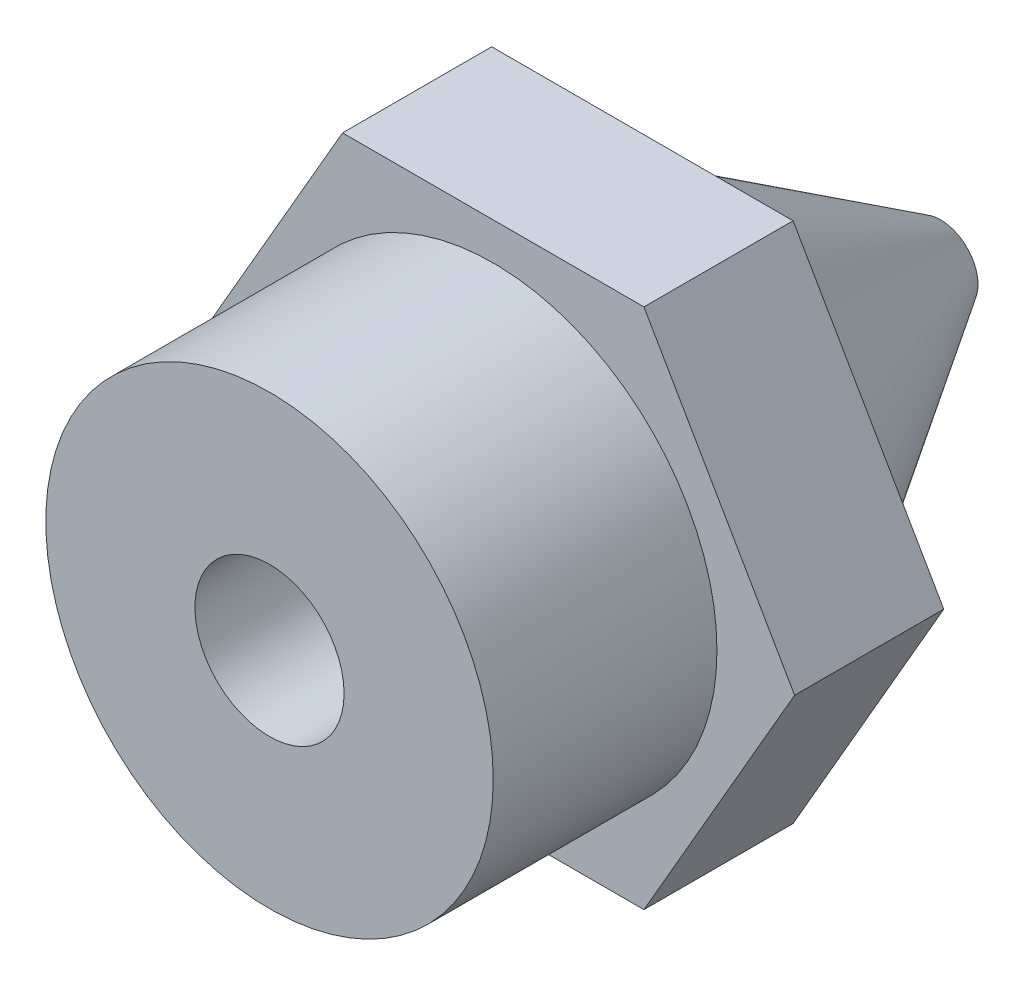
ISO-10303-21;
HEADER;
FILE_DESCRIPTION(('STEP AP214'),'2;1');
FILE_NAME('part.step','',(''),(''),'','','');
FILE_SCHEMA(('AUTOMOTIVE_DESIGN { 1 0 10303 214 1 1 1 1 }'));
ENDSEC;
DATA;
#1=APPLICATION_CONTEXT('core data for automotive mechanical design processes');
#2=APPLICATION_PROTOCOL_DEFINITION('international standard','automotive_design',2000,#1);
#3=PRODUCT_CONTEXT('',#1,'mechanical');
#4=PRODUCT('Part','Part','',(#3));
#5=PRODUCT_RELATED_PRODUCT_CATEGORY('part','',(#4));
#6=PRODUCT_DEFINITION_FORMATION('','',#4);
#7=PRODUCT_DEFINITION_CONTEXT('part definition',#1,'design');
#8=PRODUCT_DEFINITION('design','',#6,#7);
#9=PRODUCT_DEFINITION_SHAPE('','',#8);
#10=(LENGTH_UNIT() NAMED_UNIT(*) SI_UNIT(.MILLI.,.METRE.));
#11=(NAMED_UNIT(*) PLANE_ANGLE_UNIT() SI_UNIT($,.RADIAN.));
#12=(NAMED_UNIT(*) SI_UNIT($,.STERADIAN.) SOLID_ANGLE_UNIT());
#13=UNCERTAINTY_MEASURE_WITH_UNIT(LENGTH_MEASURE(1.E-05),#10,'distance_accuracy_value','');
#14=(GEOMETRIC_REPRESENTATION_CONTEXT(3) GLOBAL_UNCERTAINTY_ASSIGNED_CONTEXT((#13)) GLOBAL_UNIT_ASSIGNED_CONTEXT((#10,
#11,#12)) REPRESENTATION_CONTEXT('',''));
#15=CARTESIAN_POINT('',(0.,0.,0.));
#16=DIRECTION('',(0.,0.,1.));
#17=DIRECTION('',(1.,0.,0.));
#18=AXIS2_PLACEMENT_3D('',#15,#16,#17);
#19=CARTESIAN_POINT('',(2.02072594216373,-3.49999999999998,9.));
#20=DIRECTION('',(-0.866025403784442,0.499999999999995,0.));
#21=DIRECTION('',(-0.499999999999995,-0.866025403784442,0.));
#22=AXIS2_PLACEMENT_3D('',#19,#20,#21);
#23=PLANE('',#22);
#24=DIRECTION('',(-0.499999999999995,-0.866025403784442,0.));
#25=VECTOR('',#24,1.);
#26=CARTESIAN_POINT('',(2.02072594216373,-3.49999999999998,4.));
#27=LINE('',#26,#25);
#28=CARTESIAN_POINT('',(4.04145188432738,0.,4.));
#29=VERTEX_POINT('',#28);
#30=CARTESIAN_POINT('',(2.02072594216373,-3.49999999999998,4.));
#31=VERTEX_POINT('',#30);
#32=EDGE_CURVE('E50',#29,#31,#27,.T.);
#33=ORIENTED_EDGE('',*,*,#32,.F.);
#34=DIRECTION('',(0.,0.,-1.));
#35=VECTOR('',#34,1.);
#36=CARTESIAN_POINT('',(4.04145188432738,0.,9.));
#37=LINE('',#36,#35);
#38=CARTESIAN_POINT('',(4.04145188432738,0.,6.));
#39=VERTEX_POINT('',#38);
#40=EDGE_CURVE('E118',#39,#29,#37,.T.);
#41=ORIENTED_EDGE('',*,*,#40,.F.);
#42=DIRECTION('',(0.499999999999995,0.866025403784442,0.));
#43=VECTOR('',#42,1.);
#44=CARTESIAN_POINT('',(2.02072594216373,-3.49999999999998,6.));
#45=LINE('',#44,#43);
#46=CARTESIAN_POINT('',(2.02072594216373,-3.49999999999998,6.));
#47=VERTEX_POINT('',#46);
#48=EDGE_CURVE('E109',#47,#39,#45,.T.);
#49=ORIENTED_EDGE('',*,*,#48,.F.);
#50=DIRECTION('',(0.,0.,-1.));
#51=VECTOR('',#50,1.);
#52=CARTESIAN_POINT('',(2.02072594216373,-3.49999999999998,9.));
#53=LINE('',#52,#51);
#54=EDGE_CURVE('E105',#47,#31,#53,.T.);
#55=ORIENTED_EDGE('',*,*,#54,.T.);
#56=EDGE_LOOP('',(#33,#41,#49,#55));
#57=FACE_BOUND('',#56,.T.);
#58=ADVANCED_FACE('F35',(#57),#23,.F.);
#59=CARTESIAN_POINT('',(4.04145188432738,0.,9.));
#60=DIRECTION('',(-0.866025403784438,-0.500000000000001,0.));
#61=DIRECTION('',(0.500000000000001,-0.866025403784438,0.));
#62=AXIS2_PLACEMENT_3D('',#59,#60,#61);
#63=PLANE('',#62);
#64=DIRECTION('',(0.500000000000001,-0.866025403784438,0.));
#65=VECTOR('',#64,1.);
#66=CARTESIAN_POINT('',(4.04145188432738,0.,4.));
#67=LINE('',#66,#65);
#68=CARTESIAN_POINT('',(2.02072594216368,3.50000000000001,4.));
#69=VERTEX_POINT('',#68);
#70=EDGE_CURVE('E165',#69,#29,#67,.T.);
#71=ORIENTED_EDGE('',*,*,#70,.F.);
#72=DIRECTION('',(0.,0.,-1.));
#73=VECTOR('',#72,1.);
#74=CARTESIAN_POINT('',(2.02072594216368,3.50000000000001,9.));
#75=LINE('',#74,#73);
#76=CARTESIAN_POINT('',(2.02072594216368,3.50000000000001,6.));
#77=VERTEX_POINT('',#76);
#78=EDGE_CURVE('E115',#77,#69,#75,.T.);
#79=ORIENTED_EDGE('',*,*,#78,.F.);
#80=DIRECTION('',(-0.500000000000001,0.866025403784438,0.));
#81=VECTOR('',#80,1.);
#82=CARTESIAN_POINT('',(4.04145188432738,0.,6.));
#83=LINE('',#82,#81);
#84=EDGE_CURVE('E154',#39,#77,#83,.T.);
#85=ORIENTED_EDGE('',*,*,#84,.F.);
#86=ORIENTED_EDGE('',*,*,#40,.T.);
#87=EDGE_LOOP('',(#71,#79,#85,#86));
#88=FACE_BOUND('',#87,.T.);
#89=ADVANCED_FACE('F164',(#88),#63,.F.);
#90=CARTESIAN_POINT('',(2.02072594216368,3.50000000000001,9.));
#91=DIRECTION('',(0.,-1.,0.));
#92=DIRECTION('',(1.,0.,0.));
#93=AXIS2_PLACEMENT_3D('',#90,#91,#92);
#94=PLANE('',#93);
#95=DIRECTION('',(1.,0.,0.));
#96=VECTOR('',#95,1.);
#97=CARTESIAN_POINT('',(2.02072594216368,3.50000000000001,4.));
#98=LINE('',#97,#96);
#99=CARTESIAN_POINT('',(-2.02072594216371,3.49999999999999,4.));
#100=VERTEX_POINT('',#99);
#101=EDGE_CURVE('E168',#100,#69,#98,.T.);
#102=ORIENTED_EDGE('',*,*,#101,.F.);
#103=DIRECTION('',(0.,0.,-1.));
#104=VECTOR('',#103,1.);
#105=CARTESIAN_POINT('',(-2.02072594216371,3.49999999999999,9.));
#106=LINE('',#105,#104);
#107=CARTESIAN_POINT('',(-2.02072594216371,3.49999999999999,6.));
#108=VERTEX_POINT('',#107);
#109=EDGE_CURVE('E107',#108,#100,#106,.T.);
#110=ORIENTED_EDGE('',*,*,#109,.F.);
#111=DIRECTION('',(-1.,0.,0.));
#112=VECTOR('',#111,1.);
#113=CARTESIAN_POINT('',(2.02072594216368,3.50000000000001,6.));
#114=LINE('',#113,#112);
#115=EDGE_CURVE('E152',#77,#108,#114,.T.);
#116=ORIENTED_EDGE('',*,*,#115,.F.);
#117=ORIENTED_EDGE('',*,*,#78,.T.);
#118=EDGE_LOOP('',(#102,#110,#116,#117));
#119=FACE_BOUND('',#118,.T.);
#120=ADVANCED_FACE('F192',(#119),#94,.F.);
#121=CARTESIAN_POINT('',(-2.02072594216371,3.49999999999999,9.));
#122=DIRECTION('',(0.866025403784441,-0.499999999999995,0.));
#123=DIRECTION('',(0.499999999999995,0.866025403784442,0.));
#124=AXIS2_PLACEMENT_3D('',#121,#122,#123);
#125=PLANE('',#124);
#126=DIRECTION('',(0.499999999999995,0.866025403784442,0.));
#127=VECTOR('',#126,1.);
#128=CARTESIAN_POINT('',(-2.02072594216371,3.49999999999999,4.));
#129=LINE('',#128,#127);
#130=CARTESIAN_POINT('',(-4.04145188432738,0.,4.));
#131=VERTEX_POINT('',#130);
#132=EDGE_CURVE('E101',#131,#100,#129,.T.);
#133=ORIENTED_EDGE('',*,*,#132,.F.);
#134=DIRECTION('',(0.,0.,-1.));
#135=VECTOR('',#134,1.);
#136=CARTESIAN_POINT('',(-4.04145188432738,0.,9.));
#137=LINE('',#136,#135);
#138=CARTESIAN_POINT('',(-4.04145188432738,0.,6.));
#139=VERTEX_POINT('',#138);
#140=EDGE_CURVE('E100',#139,#131,#137,.T.);
#141=ORIENTED_EDGE('',*,*,#140,.F.);
#142=DIRECTION('',(-0.499999999999995,-0.866025403784442,0.));
#143=VECTOR('',#142,1.);
#144=CARTESIAN_POINT('',(-2.02072594216371,3.49999999999999,6.));
#145=LINE('',#144,#143);
#146=EDGE_CURVE('E150',#108,#139,#145,.T.);
#147=ORIENTED_EDGE('',*,*,#146,.F.);
#148=ORIENTED_EDGE('',*,*,#109,.T.);
#149=EDGE_LOOP('',(#133,#141,#147,#148));
#150=FACE_BOUND('',#149,.T.);
#151=ADVANCED_FACE('F197',(#150),#125,.F.);
#152=CARTESIAN_POINT('',(-4.04145188432738,0.,9.));
#153=DIRECTION('',(0.866025403784434,0.500000000000007,0.));
#154=DIRECTION('',(-0.500000000000007,0.866025403784435,0.));
#155=AXIS2_PLACEMENT_3D('',#152,#153,#154);
#156=PLANE('',#155);
#157=DIRECTION('',(-0.500000000000007,0.866025403784435,0.));
#158=VECTOR('',#157,1.);
#159=CARTESIAN_POINT('',(-4.04145188432738,0.,4.));
#160=LINE('',#159,#158);
#161=CARTESIAN_POINT('',(-2.02072594216366,-3.50000000000002,4.));
#162=VERTEX_POINT('',#161);
#163=EDGE_CURVE('E87',#162,#131,#160,.T.);
#164=ORIENTED_EDGE('',*,*,#163,.F.);
#165=DIRECTION('',(0.,0.,-1.));
#166=VECTOR('',#165,1.);
#167=CARTESIAN_POINT('',(-2.02072594216366,-3.50000000000002,9.));
#168=LINE('',#167,#166);
#169=CARTESIAN_POINT('',(-2.02072594216366,-3.50000000000002,6.));
#170=VERTEX_POINT('',#169);
#171=EDGE_CURVE('E98',#170,#162,#168,.T.);
#172=ORIENTED_EDGE('',*,*,#171,.F.);
#173=DIRECTION('',(0.500000000000007,-0.866025403784435,0.));
#174=VECTOR('',#173,1.);
#175=CARTESIAN_POINT('',(-4.04145188432738,0.,6.));
#176=LINE('',#175,#174);
#177=EDGE_CURVE('E58',#139,#170,#176,.T.);
#178=ORIENTED_EDGE('',*,*,#177,.F.);
#179=ORIENTED_EDGE('',*,*,#140,.T.);
#180=EDGE_LOOP('',(#164,#172,#178,#179));
#181=FACE_BOUND('',#180,.T.);
#182=ADVANCED_FACE('F97',(#181),#156,.F.);
#183=CARTESIAN_POINT('',(-2.02072594216366,-3.50000000000002,9.));
#184=DIRECTION('',(0.,1.,0.));
#185=DIRECTION('',(-1.,0.,0.));
#186=AXIS2_PLACEMENT_3D('',#183,#184,#185);
#187=PLANE('',#186);
#188=DIRECTION('',(-1.,0.,0.));
#189=VECTOR('',#188,1.);
#190=CARTESIAN_POINT('',(-2.02072594216366,-3.50000000000002,4.));
#191=LINE('',#190,#189);
#192=EDGE_CURVE('E43',#31,#162,#191,.T.);
#193=ORIENTED_EDGE('',*,*,#192,.F.);
#194=ORIENTED_EDGE('',*,*,#54,.F.);
#195=DIRECTION('',(1.,0.,0.));
#196=VECTOR('',#195,1.);
#197=CARTESIAN_POINT('',(-2.02072594216366,-3.50000000000002,6.));
#198=LINE('',#197,#196);
#199=EDGE_CURVE('E93',#170,#47,#198,.T.);
#200=ORIENTED_EDGE('',*,*,#199,.F.);
#201=ORIENTED_EDGE('',*,*,#171,.T.);
#202=EDGE_LOOP('',(#193,#194,#200,#201));
#203=FACE_BOUND('',#202,.T.);
#204=ADVANCED_FACE('F104',(#203),#187,.F.);
#205=CARTESIAN_POINT('',(0.,0.,0.));
#206=DIRECTION('',(0.,0.,1.));
#207=DIRECTION('',(1.,0.,0.));
#208=AXIS2_PLACEMENT_3D('',#205,#206,#207);
#209=PLANE('',#208);
#210=CARTESIAN_POINT('',(0.,0.,0.));
#211=DIRECTION('',(0.,0.,1.));
#212=DIRECTION('',(1.,0.,0.));
#213=AXIS2_PLACEMENT_3D('',#210,#211,#212);
#214=CIRCLE('',#213,0.50052259236269);
#215=CARTESIAN_POINT('',(0.50052259236269,0.,0.));
#216=VERTEX_POINT('',#215);
#217=EDGE_CURVE('E11',#216,#216,#214,.F.);
#218=ORIENTED_EDGE('',*,*,#217,.T.);
#219=EDGE_LOOP('',(#218));
#220=FACE_BOUND('',#219,.T.);
#221=CARTESIAN_POINT('',(0.,0.,0.));
#222=DIRECTION('',(0.,0.,-1.));
#223=DIRECTION('',(-1.,0.,0.));
#224=AXIS2_PLACEMENT_3D('',#221,#222,#223);
#225=CIRCLE('',#224,0.199999999999999);
#226=CARTESIAN_POINT('',(-0.199999999999999,0.,0.));
#227=VERTEX_POINT('',#226);
#228=EDGE_CURVE('E137',#227,#227,#225,.T.);
#229=ORIENTED_EDGE('',*,*,#228,.F.);
#230=EDGE_LOOP('',(#229));
#231=FACE_BOUND('',#230,.T.);
#232=ADVANCED_FACE('F206',(#220,#231),#209,.F.);
#233=CARTESIAN_POINT('',(0.,0.,6.));
#234=DIRECTION('',(0.,0.,1.));
#235=DIRECTION('',(1.,0.,0.));
#236=AXIS2_PLACEMENT_3D('',#233,#234,#235);
#237=PLANE('',#236);
#238=CARTESIAN_POINT('',(0.,0.,6.));
#239=DIRECTION('',(0.,0.,1.));
#240=DIRECTION('',(1.,0.,0.));
#241=AXIS2_PLACEMENT_3D('',#238,#239,#240);
#242=CIRCLE('',#241,3.);
#243=CARTESIAN_POINT('',(3.,0.,6.));
#244=VERTEX_POINT('',#243);
#245=EDGE_CURVE('E144',#244,#244,#242,.T.);
#246=ORIENTED_EDGE('',*,*,#245,.F.);
#247=EDGE_LOOP('',(#246));
#248=FACE_BOUND('',#247,.T.);
#249=ORIENTED_EDGE('',*,*,#48,.T.);
#250=ORIENTED_EDGE('',*,*,#84,.T.);
#251=ORIENTED_EDGE('',*,*,#115,.T.);
#252=ORIENTED_EDGE('',*,*,#146,.T.);
#253=ORIENTED_EDGE('',*,*,#177,.T.);
#254=ORIENTED_EDGE('',*,*,#199,.T.);
#255=EDGE_LOOP('',(#249,#250,#251,#252,#253,#254));
#256=FACE_BOUND('',#255,.T.);
#257=ADVANCED_FACE('F157',(#248,#256),#237,.T.);
#258=CARTESIAN_POINT('',(0.,0.,6.));
#259=DIRECTION('',(0.,0.,1.));
#260=DIRECTION('',(1.,0.,0.));
#261=AXIS2_PLACEMENT_3D('',#258,#259,#260);
#262=CYLINDRICAL_SURFACE('',#261,3.);
#263=ORIENTED_EDGE('',*,*,#245,.T.);
#264=EDGE_LOOP('',(#263));
#265=FACE_BOUND('',#264,.T.);
#266=CARTESIAN_POINT('',(0.,0.,9.));
#267=DIRECTION('',(0.,0.,1.));
#268=DIRECTION('',(1.,0.,0.));
#269=AXIS2_PLACEMENT_3D('',#266,#267,#268);
#270=CIRCLE('',#269,3.);
#271=CARTESIAN_POINT('',(3.,0.,9.));
#272=VERTEX_POINT('',#271);
#273=EDGE_CURVE('E143',#272,#272,#270,.T.);
#274=ORIENTED_EDGE('',*,*,#273,.F.);
#275=EDGE_LOOP('',(#274));
#276=FACE_BOUND('',#275,.T.);
#277=ADVANCED_FACE('F214',(#265,#276),#262,.T.);
#278=CARTESIAN_POINT('',(0.,0.,9.));
#279=DIRECTION('',(0.,0.,1.));
#280=DIRECTION('',(1.,0.,0.));
#281=AXIS2_PLACEMENT_3D('',#278,#279,#280);
#282=PLANE('',#281);
#283=CARTESIAN_POINT('',(0.,0.,9.));
#284=DIRECTION('',(0.,0.,1.));
#285=DIRECTION('',(1.,0.,0.));
#286=AXIS2_PLACEMENT_3D('',#283,#284,#285);
#287=CIRCLE('',#286,0.999999999999999);
#288=CARTESIAN_POINT('',(0.999999999999999,0.,9.));
#289=VERTEX_POINT('',#288);
#290=EDGE_CURVE('E124',#289,#289,#287,.T.);
#291=ORIENTED_EDGE('',*,*,#290,.F.);
#292=EDGE_LOOP('',(#291));
#293=FACE_BOUND('',#292,.T.);
#294=ORIENTED_EDGE('',*,*,#273,.T.);
#295=EDGE_LOOP('',(#294));
#296=FACE_BOUND('',#295,.T.);
#297=ADVANCED_FACE('F210',(#293,#296),#282,.T.);
#298=CARTESIAN_POINT('',(0.,0.,1.5));
#299=DIRECTION('',(0.,0.,1.));
#300=DIRECTION('',(1.,0.,0.));
#301=AXIS2_PLACEMENT_3D('',#298,#299,#300);
#302=CONICAL_SURFACE('',#301,0.999999999999998,1.02974425867665);
#303=CARTESIAN_POINT('',(0.,0.,1.34978484524311));
#304=DIRECTION('',(0.,0.,1.));
#305=DIRECTION('',(1.,0.,0.));
#306=AXIS2_PLACEMENT_3D('',#303,#304,#305);
#307=CIRCLE('',#306,0.749999999999998);
#308=CARTESIAN_POINT('',(0.749999999999998,0.,1.34978484524311));
#309=VERTEX_POINT('',#308);
#310=EDGE_CURVE('E122',#309,#309,#307,.F.);
#311=ORIENTED_EDGE('',*,*,#310,.T.);
#312=EDGE_LOOP('',(#311));
#313=FACE_BOUND('',#312,.T.);
#314=CARTESIAN_POINT('',(0.,0.,1.5));
#315=DIRECTION('',(0.,0.,1.));
#316=DIRECTION('',(1.,0.,0.));
#317=AXIS2_PLACEMENT_3D('',#314,#315,#316);
#318=CIRCLE('',#317,0.999999999999998);
#319=CARTESIAN_POINT('',(0.999999999999998,0.,1.5));
#320=VERTEX_POINT('',#319);
#321=EDGE_CURVE('E129',#320,#320,#318,.T.);
#322=ORIENTED_EDGE('',*,*,#321,.T.);
#323=EDGE_LOOP('',(#322));
#324=FACE_BOUND('',#323,.T.);
#325=ADVANCED_FACE('F213',(#313,#324),#302,.F.);
#326=CARTESIAN_POINT('',(0.,0.,9.));
#327=DIRECTION('',(0.,0.,1.));
#328=DIRECTION('',(1.,0.,0.));
#329=AXIS2_PLACEMENT_3D('',#326,#327,#328);
#330=CYLINDRICAL_SURFACE('',#329,0.999999999999999);
#331=ORIENTED_EDGE('',*,*,#321,.F.);
#332=EDGE_LOOP('',(#331));
#333=FACE_BOUND('',#332,.T.);
#334=ORIENTED_EDGE('',*,*,#290,.T.);
#335=EDGE_LOOP('',(#334));
#336=FACE_BOUND('',#335,.T.);
#337=ADVANCED_FACE('F224',(#333,#336),#330,.F.);
#338=CARTESIAN_POINT('',(0.,0.,9.));
#339=DIRECTION('',(0.,0.,1.));
#340=DIRECTION('',(1.,0.,0.));
#341=AXIS2_PLACEMENT_3D('',#338,#339,#340);
#342=CYLINDRICAL_SURFACE('',#341,0.749999999999998);
#343=CARTESIAN_POINT('',(0.,0.,0.8));
#344=DIRECTION('',(0.,0.,1.));
#345=DIRECTION('',(1.,0.,0.));
#346=AXIS2_PLACEMENT_3D('',#343,#344,#345);
#347=CIRCLE('',#346,0.749999999999998);
#348=CARTESIAN_POINT('',(0.749999999999998,0.,0.8));
#349=VERTEX_POINT('',#348);
#350=EDGE_CURVE('E125',#349,#349,#347,.T.);
#351=ORIENTED_EDGE('',*,*,#350,.F.);
#352=EDGE_LOOP('',(#351));
#353=FACE_BOUND('',#352,.T.);
#354=ORIENTED_EDGE('',*,*,#310,.F.);
#355=EDGE_LOOP('',(#354));
#356=FACE_BOUND('',#355,.T.);
#357=ADVANCED_FACE('F227',(#353,#356),#342,.F.);
#358=CARTESIAN_POINT('',(0.,0.,0.8));
#359=DIRECTION('',(0.,0.,1.));
#360=DIRECTION('',(1.,0.,0.));
#361=AXIS2_PLACEMENT_3D('',#358,#359,#360);
#362=CONICAL_SURFACE('',#361,0.749999999999998,1.02974425867665);
#363=CARTESIAN_POINT('',(0.,0.,0.469526659534841));
#364=DIRECTION('',(0.,0.,1.));
#365=DIRECTION('',(1.,0.,0.));
#366=AXIS2_PLACEMENT_3D('',#363,#364,#365);
#367=CIRCLE('',#366,0.199999999999999);
#368=CARTESIAN_POINT('',(0.199999999999999,0.,0.469526659534841));
#369=VERTEX_POINT('',#368);
#370=EDGE_CURVE('E132',#369,#369,#367,.F.);
#371=CARTESIAN_POINT('',(0.199999999999999,0.,0.469526659534841));
#372=CARTESIAN_POINT('',(0.205729166666666,0.,0.472969090164687));
#373=CARTESIAN_POINT('',(0.211458333333333,0.,0.476411520794532));
#374=CARTESIAN_POINT('',(0.222916666666666,0.,0.483296382054223));
#375=CARTESIAN_POINT('',(0.228645833333333,0.,0.486738812684068));
#376=CARTESIAN_POINT('',(0.240104166666666,0.,0.493623673943759));
#377=CARTESIAN_POINT('',(0.245833333333333,0.,0.497066104573605));
#378=CARTESIAN_POINT('',(0.257291666666666,0.,0.503950965833295));
#379=CARTESIAN_POINT('',(0.263020833333333,0.,0.507393396463141));
#380=CARTESIAN_POINT('',(0.274479166666666,0.,0.514278257722832));
#381=CARTESIAN_POINT('',(0.280208333333333,0.,0.517720688352677));
#382=CARTESIAN_POINT('',(0.291666666666666,0.,0.524605549612368));
#383=CARTESIAN_POINT('',(0.297395833333333,0.,0.528047980242213));
#384=CARTESIAN_POINT('',(0.308854166666666,0.,0.534932841501904));
#385=CARTESIAN_POINT('',(0.314583333333332,0.,0.538375272131749));
#386=CARTESIAN_POINT('',(0.326041666666666,0.,0.54526013339144));
#387=CARTESIAN_POINT('',(0.331770833333332,0.,0.548702564021286));
#388=CARTESIAN_POINT('',(0.343229166666666,0.,0.555587425280976));
#389=CARTESIAN_POINT('',(0.348958333333332,0.,0.559029855910822));
#390=CARTESIAN_POINT('',(0.360416666666666,0.,0.565914717170513));
#391=CARTESIAN_POINT('',(0.366145833333332,0.,0.569357147800358));
#392=CARTESIAN_POINT('',(0.377604166666666,0.,0.576242009060049));
#393=CARTESIAN_POINT('',(0.383333333333332,0.,0.579684439689894));
#394=CARTESIAN_POINT('',(0.394791666666666,0.,0.586569300949585));
#395=CARTESIAN_POINT('',(0.400520833333332,0.,0.590011731579431));
#396=CARTESIAN_POINT('',(0.411979166666665,0.,0.596896592839121));
#397=CARTESIAN_POINT('',(0.417708333333332,0.,0.600339023468967));
#398=CARTESIAN_POINT('',(0.429166666666665,0.,0.607223884728658));
#399=CARTESIAN_POINT('',(0.434895833333332,0.,0.610666315358503));
#400=CARTESIAN_POINT('',(0.446354166666665,0.,0.617551176618194));
#401=CARTESIAN_POINT('',(0.452083333333332,0.,0.620993607248039));
#402=CARTESIAN_POINT('',(0.463541666666665,0.,0.62787846850773));
#403=CARTESIAN_POINT('',(0.469270833333332,0.,0.631320899137575));
#404=CARTESIAN_POINT('',(0.480729166666665,0.,0.638205760397266));
#405=CARTESIAN_POINT('',(0.486458333333332,0.,0.641648191027112));
#406=CARTESIAN_POINT('',(0.497916666666665,0.,0.648533052286802));
#407=CARTESIAN_POINT('',(0.503645833333332,0.,0.651975482916648));
#408=CARTESIAN_POINT('',(0.515104166666665,0.,0.658860344176339));
#409=CARTESIAN_POINT('',(0.520833333333332,0.,0.662302774806184));
#410=CARTESIAN_POINT('',(0.532291666666665,0.,0.669187636065875));
#411=CARTESIAN_POINT('',(0.538020833333332,0.,0.67263006669572));
#412=CARTESIAN_POINT('',(0.549479166666665,0.,0.679514927955411));
#413=CARTESIAN_POINT('',(0.555208333333332,0.,0.682957358585257));
#414=CARTESIAN_POINT('',(0.566666666666665,0.,0.689842219844947));
#415=CARTESIAN_POINT('',(0.572395833333332,0.,0.693284650474793));
#416=CARTESIAN_POINT('',(0.583854166666665,0.,0.700169511734483));
#417=CARTESIAN_POINT('',(0.589583333333332,0.,0.703611942364329));
#418=CARTESIAN_POINT('',(0.601041666666665,0.,0.71049680362402));
#419=CARTESIAN_POINT('',(0.606770833333331,0.,0.713939234253865));
#420=CARTESIAN_POINT('',(0.618229166666665,0.,0.720824095513556));
#421=CARTESIAN_POINT('',(0.623958333333331,0.,0.724266526143401));
#422=CARTESIAN_POINT('',(0.635416666666665,0.,0.731151387403092));
#423=CARTESIAN_POINT('',(0.641145833333331,0.,0.734593818032938));
#424=CARTESIAN_POINT('',(0.652604166666665,0.,0.741478679292628));
#425=CARTESIAN_POINT('',(0.658333333333331,0.,0.744921109922474));
#426=CARTESIAN_POINT('',(0.669791666666665,0.,0.751805971182165));
#427=CARTESIAN_POINT('',(0.675520833333331,0.,0.75524840181201));
#428=CARTESIAN_POINT('',(0.686979166666665,0.,0.762133263071701));
#429=CARTESIAN_POINT('',(0.692708333333331,0.,0.765575693701546));
#430=CARTESIAN_POINT('',(0.704166666666665,0.,0.772460554961237));
#431=CARTESIAN_POINT('',(0.709895833333331,0.,0.775902985591083));
#432=CARTESIAN_POINT('',(0.721354166666665,0.,0.782787846850773));
#433=CARTESIAN_POINT('',(0.727083333333331,0.,0.786230277480619));
#434=CARTESIAN_POINT('',(0.738541666666664,0.,0.79311513874031));
#435=CARTESIAN_POINT('',(0.744270833333331,0.,0.796557569370155));
#436=CARTESIAN_POINT('',(0.749999999999998,0.,0.8));
#437=B_SPLINE_CURVE_WITH_KNOTS('',3,(#371,#372,#373,#374,#375,#376,#377,#378,#379,#380,#381,
#382,#383,#384,#385,#386,#387,#388,#389,#390,#391,#392,#393,#394,#395,#396,#397,#398,#399,#400,
#401,#402,#403,#404,#405,#406,#407,#408,#409,#410,#411,#412,#413,#414,#415,#416,#417,#418,#419,
#420,#421,#422,#423,#424,#425,#426,#427,#428,#429,#430,#431,#432,#433,#434,#435,#436),
.UNSPECIFIED.,.F.,.F.,(4,2,2,2,2,2,2,2,2,2,2,2,2,2,2,2,2,2,2,2,2,2,2,2,2,2,2,2,2,2,2,2,4),(0.,
0.0200515115146385,0.0401030230292769,0.0601545345439154,0.0802060460585539,0.100257557573192,
0.120309069087831,0.140360580602469,0.160412092117108,0.180463603631746,0.200515115146385,
0.220566626661023,0.240618138175662,0.2606696496903,0.280721161204938,0.300772672719577,
0.320824184234215,0.340875695748854,0.360927207263492,0.380978718778131,0.401030230292769,
0.421081741807408,0.441133253322046,0.461184764836685,0.481236276351323,0.501287787865962,
0.5213392993806,0.541390810895238,0.561442322409877,0.581493833924515,0.601545345439154,
0.621596856953792,0.641648368468431),.UNSPECIFIED.);
#438=EDGE_CURVE('BSEAM185',#369,#349,#437,.T.);
#439=ORIENTED_EDGE('',*,*,#370,.T.);
#440=ORIENTED_EDGE('',*,*,#350,.T.);
#441=ORIENTED_EDGE('',*,*,#438,.T.);
#442=ORIENTED_EDGE('',*,*,#438,.F.);
#443=EDGE_LOOP('',(#439,#441,#440,#442));
#444=FACE_BOUND('',#443,.T.);
#445=ADVANCED_FACE('F185',(#444),#362,.F.);
#446=CARTESIAN_POINT('',(0.,0.,0.));
#447=DIRECTION('',(0.,0.,-1.));
#448=DIRECTION('',(-1.,0.,0.));
#449=AXIS2_PLACEMENT_3D('',#446,#447,#448);
#450=CYLINDRICAL_SURFACE('',#449,0.199999999999999);
#451=ORIENTED_EDGE('',*,*,#228,.T.);
#452=EDGE_LOOP('',(#451));
#453=FACE_BOUND('',#452,.T.);
#454=ORIENTED_EDGE('',*,*,#370,.F.);
#455=EDGE_LOOP('',(#454));
#456=FACE_BOUND('',#455,.T.);
#457=ADVANCED_FACE('F179',(#453,#456),#450,.F.);
#458=CARTESIAN_POINT('',(0.,0.,4.));
#459=DIRECTION('',(0.,0.,-1.));
#460=DIRECTION('',(-1.,0.,0.));
#461=AXIS2_PLACEMENT_3D('',#458,#459,#460);
#462=PLANE('',#461);
#463=CARTESIAN_POINT('',(0.,0.,4.));
#464=DIRECTION('',(0.,0.,-1.));
#465=DIRECTION('',(-1.,0.,0.));
#466=AXIS2_PLACEMENT_3D('',#463,#464,#465);
#467=CIRCLE('',#466,3.);
#468=CARTESIAN_POINT('',(2.99999999999999,0.,4.));
#469=VERTEX_POINT('',#468);
#470=EDGE_CURVE('E102',#469,#469,#467,.T.);
#471=ORIENTED_EDGE('',*,*,#470,.F.);
#472=EDGE_LOOP('',(#471));
#473=FACE_BOUND('',#472,.T.);
#474=ORIENTED_EDGE('',*,*,#32,.T.);
#475=ORIENTED_EDGE('',*,*,#192,.T.);
#476=ORIENTED_EDGE('',*,*,#163,.T.);
#477=ORIENTED_EDGE('',*,*,#132,.T.);
#478=ORIENTED_EDGE('',*,*,#101,.T.);
#479=ORIENTED_EDGE('',*,*,#70,.T.);
#480=EDGE_LOOP('',(#474,#475,#476,#477,#478,#479));
#481=FACE_BOUND('',#480,.T.);
#482=ADVANCED_FACE('F86',(#473,#481),#462,.T.);
#483=CARTESIAN_POINT('',(0.,0.,0.));
#484=DIRECTION('',(0.,0.,1.));
#485=DIRECTION('',(1.,0.,0.));
#486=AXIS2_PLACEMENT_3D('',#483,#484,#485);
#487=CONICAL_SURFACE('',#486,0.50052259236269,0.558505360638183);
#488=CARTESIAN_POINT('',(2.99999999999999,0.,4.));
#489=CARTESIAN_POINT('',(2.97396377700376,0.,3.95833333333333));
#490=CARTESIAN_POINT('',(2.94792755400754,0.,3.91666666666667));
#491=CARTESIAN_POINT('',(2.8958551080151,0.,3.83333333333333));
#492=CARTESIAN_POINT('',(2.86981888501888,0.,3.79166666666667));
#493=CARTESIAN_POINT('',(2.81774643902643,0.,3.70833333333333));
#494=CARTESIAN_POINT('',(2.79171021603021,0.,3.66666666666667));
#495=CARTESIAN_POINT('',(2.73963777003777,0.,3.58333333333333));
#496=CARTESIAN_POINT('',(2.71360154704155,0.,3.54166666666667));
#497=CARTESIAN_POINT('',(2.6615291010491,0.,3.45833333333333));
#498=CARTESIAN_POINT('',(2.63549287805288,0.,3.41666666666667));
#499=CARTESIAN_POINT('',(2.58342043206044,0.,3.33333333333333));
#500=CARTESIAN_POINT('',(2.55738420906421,0.,3.29166666666667));
#501=CARTESIAN_POINT('',(2.50531176307177,0.,3.20833333333333));
#502=CARTESIAN_POINT('',(2.47927554007555,0.,3.16666666666667));
#503=CARTESIAN_POINT('',(2.42720309408311,0.,3.08333333333333));
#504=CARTESIAN_POINT('',(2.40116687108688,0.,3.04166666666667));
#505=CARTESIAN_POINT('',(2.34909442509444,0.,2.95833333333333));
#506=CARTESIAN_POINT('',(2.32305820209822,0.,2.91666666666667));
#507=CARTESIAN_POINT('',(2.27098575610577,0.,2.83333333333333));
#508=CARTESIAN_POINT('',(2.24494953310955,0.,2.79166666666667));
#509=CARTESIAN_POINT('',(2.19287708711711,0.,2.70833333333333));
#510=CARTESIAN_POINT('',(2.16684086412089,0.,2.66666666666667));
#511=CARTESIAN_POINT('',(2.11476841812844,0.,2.58333333333333));
#512=CARTESIAN_POINT('',(2.08873219513222,0.,2.54166666666667));
#513=CARTESIAN_POINT('',(2.03665974913978,0.,2.45833333333333));
#514=CARTESIAN_POINT('',(2.01062352614356,0.,2.41666666666667));
#515=CARTESIAN_POINT('',(1.95855108015111,0.,2.33333333333333));
#516=CARTESIAN_POINT('',(1.93251485715489,0.,2.29166666666667));
#517=CARTESIAN_POINT('',(1.88044241116245,0.,2.20833333333333));
#518=CARTESIAN_POINT('',(1.85440618816623,0.,2.16666666666667));
#519=CARTESIAN_POINT('',(1.80233374217378,0.,2.08333333333333));
#520=CARTESIAN_POINT('',(1.77629751917756,0.,2.04166666666667));
#521=CARTESIAN_POINT('',(1.72422507318512,0.,1.95833333333333));
#522=CARTESIAN_POINT('',(1.69818885018889,0.,1.91666666666667));
#523=CARTESIAN_POINT('',(1.64611640419645,0.,1.83333333333333));
#524=CARTESIAN_POINT('',(1.62008018120023,0.,1.79166666666667));
#525=CARTESIAN_POINT('',(1.56800773520778,0.,1.70833333333333));
#526=CARTESIAN_POINT('',(1.54197151221156,0.,1.66666666666667));
#527=CARTESIAN_POINT('',(1.48989906621912,0.,1.58333333333333));
#528=CARTESIAN_POINT('',(1.4638628432229,0.,1.54166666666667));
#529=CARTESIAN_POINT('',(1.41179039723045,0.,1.45833333333333));
#530=CARTESIAN_POINT('',(1.38575417423423,0.,1.41666666666667));
#531=CARTESIAN_POINT('',(1.33368172824179,0.,1.33333333333333));
#532=CARTESIAN_POINT('',(1.30764550524557,0.,1.29166666666667));
#533=CARTESIAN_POINT('',(1.25557305925312,0.,1.20833333333333));
#534=CARTESIAN_POINT('',(1.2295368362569,0.,1.16666666666667));
#535=CARTESIAN_POINT('',(1.17746439026446,0.,1.08333333333333));
#536=CARTESIAN_POINT('',(1.15142816726824,0.,1.04166666666667));
#537=CARTESIAN_POINT('',(1.09935572127579,0.,0.958333333333333));
#538=CARTESIAN_POINT('',(1.07331949827957,0.,0.916666666666667));
#539=CARTESIAN_POINT('',(1.02124705228713,0.,0.833333333333333));
#540=CARTESIAN_POINT('',(0.995210829290905,0.,0.791666666666667));
#541=CARTESIAN_POINT('',(0.943138383298461,0.,0.708333333333333));
#542=CARTESIAN_POINT('',(0.917102160302239,0.,0.666666666666667));
#543=CARTESIAN_POINT('',(0.865029714309796,0.,0.583333333333333));
#544=CARTESIAN_POINT('',(0.838993491313574,0.,0.541666666666667));
#545=CARTESIAN_POINT('',(0.78692104532113,0.,0.458333333333333));
#546=CARTESIAN_POINT('',(0.760884822324908,0.,0.416666666666667));
#547=CARTESIAN_POINT('',(0.708812376332465,0.,0.333333333333333));
#548=CARTESIAN_POINT('',(0.682776153336243,0.,0.291666666666667));
#549=CARTESIAN_POINT('',(0.630703707343799,0.,0.208333333333333));
#550=CARTESIAN_POINT('',(0.604667484347577,0.,0.166666666666667));
#551=CARTESIAN_POINT('',(0.552595038355134,0.,0.0833333333333335));
#552=CARTESIAN_POINT('',(0.526558815358912,0.,0.0416666666666668));
#553=CARTESIAN_POINT('',(0.50052259236269,0.,0.));
#554=B_SPLINE_CURVE_WITH_KNOTS('',3,(#488,#489,#490,#491,#492,#493,#494,#495,#496,#497,#498,
#499,#500,#501,#502,#503,#504,#505,#506,#507,#508,#509,#510,#511,#512,#513,#514,#515,#516,#517,
#518,#519,#520,#521,#522,#523,#524,#525,#526,#527,#528,#529,#530,#531,#532,#533,#534,#535,#536,
#537,#538,#539,#540,#541,#542,#543,#544,#545,#546,#547,#548,#549,#550,#551,#552,#553),
.UNSPECIFIED.,.F.,.F.,(4,2,2,2,2,2,2,2,2,2,2,2,2,2,2,2,2,2,2,2,2,2,2,2,2,2,2,2,2,2,2,2,4),(0.,
0.147397300420262,0.294794600840524,0.442191901260785,0.589589201681047,0.736986502101309,
0.884383802521571,1.03178110294183,1.17917840336209,1.32657570378236,1.47397300420262,
1.62137030462288,1.76876760504314,1.9161649054634,2.06356220588366,2.21095950630393,
2.35835680672419,2.50575410714445,2.65315140756471,2.80054870798497,2.94794600840524,
3.0953433088255,3.24274060924576,3.39013790966602,3.53753521008628,3.68493251050655,
3.83232981092681,3.97972711134707,4.12712441176733,4.27452171218759,4.42191901260786,
4.56931631302812,4.71671361344838),.UNSPECIFIED.);
#555=EDGE_CURVE('BSEAM37',#469,#216,#554,.T.);
#556=ORIENTED_EDGE('',*,*,#470,.T.);
#557=ORIENTED_EDGE('',*,*,#217,.F.);
#558=ORIENTED_EDGE('',*,*,#555,.T.);
#559=ORIENTED_EDGE('',*,*,#555,.F.);
#560=EDGE_LOOP('',(#556,#558,#557,#559));
#561=FACE_BOUND('',#560,.T.);
#562=ADVANCED_FACE('F37',(#561),#487,.T.);
#563=CLOSED_SHELL('',(#58,#89,#120,#151,#182,#204,#232,#257,#277,#297,#325,#337,#357,#445,#457,
#482,#562));
#564=MANIFOLD_SOLID_BREP('B2',#563);
#565=ADVANCED_BREP_SHAPE_REPRESENTATION('',(#18,#564),#14);
#566=SHAPE_DEFINITION_REPRESENTATION(#9,#565);
ENDSEC;
END-ISO-10303-21;
